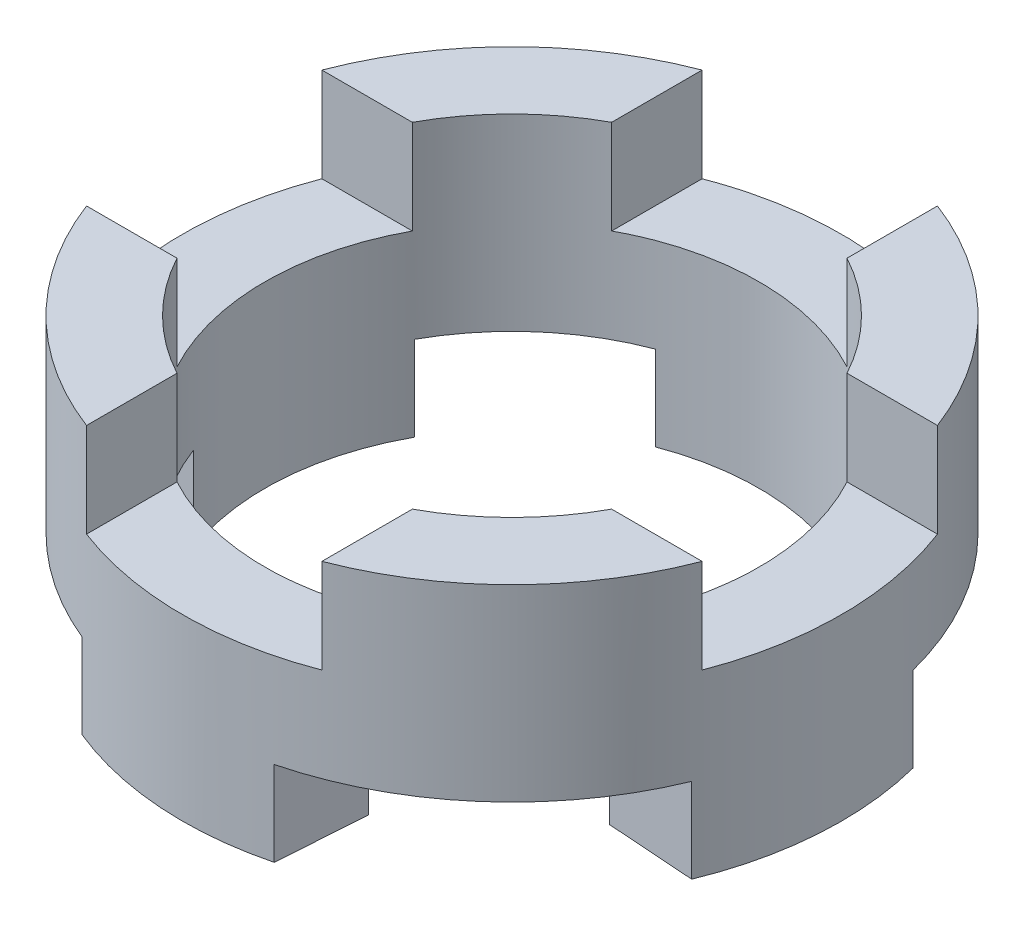
ISO-10303-21;
HEADER;
FILE_DESCRIPTION(('STEP AP214'),'2;1');
FILE_NAME('part.step','',(''),(''),'','','');
FILE_SCHEMA(('AUTOMOTIVE_DESIGN { 1 0 10303 214 1 1 1 1 }'));
ENDSEC;
DATA;
#1=APPLICATION_CONTEXT('core data for automotive mechanical design processes');
#2=APPLICATION_PROTOCOL_DEFINITION('international standard','automotive_design',2000,#1);
#3=PRODUCT_CONTEXT('',#1,'mechanical');
#4=PRODUCT('Part','Part','',(#3));
#5=PRODUCT_RELATED_PRODUCT_CATEGORY('part','',(#4));
#6=PRODUCT_DEFINITION_FORMATION('','',#4);
#7=PRODUCT_DEFINITION_CONTEXT('part definition',#1,'design');
#8=PRODUCT_DEFINITION('design','',#6,#7);
#9=PRODUCT_DEFINITION_SHAPE('','',#8);
#10=(LENGTH_UNIT() NAMED_UNIT(*) SI_UNIT(.MILLI.,.METRE.));
#11=(NAMED_UNIT(*) PLANE_ANGLE_UNIT() SI_UNIT($,.RADIAN.));
#12=(NAMED_UNIT(*) SI_UNIT($,.STERADIAN.) SOLID_ANGLE_UNIT());
#13=UNCERTAINTY_MEASURE_WITH_UNIT(LENGTH_MEASURE(1.E-05),#10,'distance_accuracy_value','');
#14=(GEOMETRIC_REPRESENTATION_CONTEXT(3) GLOBAL_UNCERTAINTY_ASSIGNED_CONTEXT((#13)) GLOBAL_UNIT_ASSIGNED_CONTEXT((#10,
#11,#12)) REPRESENTATION_CONTEXT('',''));
#15=CARTESIAN_POINT('',(0.,0.,0.));
#16=DIRECTION('',(0.,0.,1.));
#17=DIRECTION('',(1.,0.,0.));
#18=AXIS2_PLACEMENT_3D('',#15,#16,#17);
#19=CARTESIAN_POINT('',(0.,0.,0.));
#20=DIRECTION('',(0.,1.,0.));
#21=DIRECTION('',(0.,0.,1.));
#22=AXIS2_PLACEMENT_3D('',#19,#20,#21);
#23=PLANE('',#22);
#24=DIRECTION('',(0.0697564737441258,0.,-0.997564050259824));
#25=VECTOR('',#24,1.);
#26=CARTESIAN_POINT('',(-2.19464091057161,0.,-0.153464242237077));
#27=LINE('',#26,#25);
#28=CARTESIAN_POINT('',(-2.65819354208839,0.,6.47564723350489));
#29=VERTEX_POINT('',#28);
#30=CARTESIAN_POINT('',(-2.52715693125308,0.,4.60173639453843));
#31=VERTEX_POINT('',#30);
#32=EDGE_CURVE('E277',#29,#31,#27,.T.);
#33=ORIENTED_EDGE('',*,*,#32,.F.);
#34=CARTESIAN_POINT('',(0.,0.,0.));
#35=DIRECTION('',(0.,1.,0.));
#36=DIRECTION('',(0.,0.,1.));
#37=AXIS2_PLACEMENT_3D('',#34,#35,#36);
#38=CIRCLE('',#37,7.);
#39=CARTESIAN_POINT('',(-6.78257571797905,0.,1.73108827905483));
#40=VERTEX_POINT('',#39);
#41=EDGE_CURVE('E492',#40,#29,#38,.T.);
#42=ORIENTED_EDGE('',*,*,#41,.F.);
#43=DIRECTION('',(-0.997564050259824,0.,-0.0697564737441261));
#44=VECTOR('',#43,1.);
#45=CARTESIAN_POINT('',(-0.153464242237077,0.,2.19464091057161));
#46=LINE('',#45,#44);
#47=CARTESIAN_POINT('',(-4.90866487901258,0.,1.86212488989015));
#48=VERTEX_POINT('',#47);
#49=EDGE_CURVE('E68',#48,#40,#46,.T.);
#50=ORIENTED_EDGE('',*,*,#49,.F.);
#51=CARTESIAN_POINT('',(0.,0.,0.));
#52=DIRECTION('',(0.,1.,0.));
#53=DIRECTION('',(0.,0.,1.));
#54=AXIS2_PLACEMENT_3D('',#51,#52,#53);
#55=CIRCLE('',#54,5.25);
#56=EDGE_CURVE('E63',#48,#31,#55,.T.);
#57=ORIENTED_EDGE('',*,*,#56,.T.);
#58=EDGE_LOOP('',(#33,#42,#50,#57));
#59=FACE_BOUND('',#58,.T.);
#60=ADVANCED_FACE('F47',(#59),#23,.F.);
#61=DIRECTION('',(-0.0697564737441259,0.,0.997564050259824));
#62=VECTOR('',#61,1.);
#63=CARTESIAN_POINT('',(2.19464091057161,0.,0.153464242237077));
#64=LINE('',#63,#62);
#65=CARTESIAN_POINT('',(1.86212488989015,0.,4.90866487901258));
#66=VERTEX_POINT('',#65);
#67=CARTESIAN_POINT('',(1.73108827905483,0.,6.78257571797905));
#68=VERTEX_POINT('',#67);
#69=EDGE_CURVE('E330',#66,#68,#64,.T.);
#70=ORIENTED_EDGE('',*,*,#69,.F.);
#71=CARTESIAN_POINT('',(4.60173639453843,0.,2.52715693125308));
#72=VERTEX_POINT('',#71);
#73=EDGE_CURVE('E282',#66,#72,#55,.T.);
#74=ORIENTED_EDGE('',*,*,#73,.T.);
#75=DIRECTION('',(-0.997564050259824,0.,-0.0697564737441258));
#76=VECTOR('',#75,1.);
#77=CARTESIAN_POINT('',(-0.153464242237077,0.,2.19464091057161));
#78=LINE('',#77,#76);
#79=CARTESIAN_POINT('',(6.47564723350489,0.,2.65819354208839));
#80=VERTEX_POINT('',#79);
#81=EDGE_CURVE('E383',#80,#72,#78,.T.);
#82=ORIENTED_EDGE('',*,*,#81,.F.);
#83=EDGE_CURVE('E505',#68,#80,#38,.T.);
#84=ORIENTED_EDGE('',*,*,#83,.F.);
#85=EDGE_LOOP('',(#70,#74,#82,#84));
#86=FACE_BOUND('',#85,.T.);
#87=ADVANCED_FACE('F628',(#86),#23,.F.);
#88=DIRECTION('',(0.997564050259824,0.,0.0697564737441262));
#89=VECTOR('',#88,1.);
#90=CARTESIAN_POINT('',(0.153464242237077,0.,-2.19464091057161));
#91=LINE('',#90,#89);
#92=CARTESIAN_POINT('',(-6.47564723350489,0.,-2.65819354208839));
#93=VERTEX_POINT('',#92);
#94=CARTESIAN_POINT('',(-4.60173639453843,0.,-2.52715693125308));
#95=VERTEX_POINT('',#94);
#96=EDGE_CURVE('E308',#93,#95,#91,.T.);
#97=ORIENTED_EDGE('',*,*,#96,.F.);
#98=CARTESIAN_POINT('',(-1.73108827905483,0.,-6.78257571797905));
#99=VERTEX_POINT('',#98);
#100=EDGE_CURVE('E654',#99,#93,#38,.T.);
#101=ORIENTED_EDGE('',*,*,#100,.F.);
#102=DIRECTION('',(0.0697564737441257,0.,-0.997564050259824));
#103=VECTOR('',#102,1.);
#104=CARTESIAN_POINT('',(-2.19464091057161,0.,-0.153464242237077));
#105=LINE('',#104,#103);
#106=CARTESIAN_POINT('',(-1.86212488989015,0.,-4.90866487901258));
#107=VERTEX_POINT('',#106);
#108=EDGE_CURVE('E336',#107,#99,#105,.T.);
#109=ORIENTED_EDGE('',*,*,#108,.F.);
#110=EDGE_CURVE('E667',#107,#95,#55,.T.);
#111=ORIENTED_EDGE('',*,*,#110,.T.);
#112=EDGE_LOOP('',(#97,#101,#109,#111));
#113=FACE_BOUND('',#112,.T.);
#114=ADVANCED_FACE('F634',(#113),#23,.F.);
#115=DIRECTION('',(-0.0697564737441259,0.,0.997564050259824));
#116=VECTOR('',#115,1.);
#117=CARTESIAN_POINT('',(2.19464091057161,0.,0.153464242237077));
#118=LINE('',#117,#116);
#119=CARTESIAN_POINT('',(2.65819354208839,0.,-6.47564723350489));
#120=VERTEX_POINT('',#119);
#121=CARTESIAN_POINT('',(2.52715693125308,0.,-4.60173639453843));
#122=VERTEX_POINT('',#121);
#123=EDGE_CURVE('E346',#120,#122,#118,.T.);
#124=ORIENTED_EDGE('',*,*,#123,.F.);
#125=CARTESIAN_POINT('',(6.78257571797905,0.,-1.73108827905484));
#126=VERTEX_POINT('',#125);
#127=EDGE_CURVE('E509',#126,#120,#38,.T.);
#128=ORIENTED_EDGE('',*,*,#127,.F.);
#129=DIRECTION('',(0.997564050259824,0.,0.0697564737441258));
#130=VECTOR('',#129,1.);
#131=CARTESIAN_POINT('',(0.153464242237077,0.,-2.19464091057161));
#132=LINE('',#131,#130);
#133=CARTESIAN_POINT('',(4.90866487901258,0.,-1.86212488989015));
#134=VERTEX_POINT('',#133);
#135=EDGE_CURVE('E373',#134,#126,#132,.T.);
#136=ORIENTED_EDGE('',*,*,#135,.F.);
#137=EDGE_CURVE('E497',#134,#122,#55,.T.);
#138=ORIENTED_EDGE('',*,*,#137,.T.);
#139=EDGE_LOOP('',(#124,#128,#136,#138));
#140=FACE_BOUND('',#139,.T.);
#141=ADVANCED_FACE('F629',(#140),#23,.F.);
#142=CARTESIAN_POINT('',(0.,4.,0.));
#143=DIRECTION('',(0.,1.,0.));
#144=DIRECTION('',(0.,0.,1.));
#145=AXIS2_PLACEMENT_3D('',#142,#143,#144);
#146=PLANE('',#145);
#147=DIRECTION('',(-1.,0.,0.));
#148=VECTOR('',#147,1.);
#149=CARTESIAN_POINT('',(-8.,4.,-2.5));
#150=LINE('',#149,#148);
#151=CARTESIAN_POINT('',(-4.61654632815485,4.,-2.5));
#152=VERTEX_POINT('',#151);
#153=CARTESIAN_POINT('',(-6.53834841531101,4.,-2.5));
#154=VERTEX_POINT('',#153);
#155=EDGE_CURVE('E284',#152,#154,#150,.T.);
#156=ORIENTED_EDGE('',*,*,#155,.F.);
#157=CARTESIAN_POINT('',(0.,4.,0.));
#158=DIRECTION('',(0.,1.,0.));
#159=DIRECTION('',(0.,0.,1.));
#160=AXIS2_PLACEMENT_3D('',#157,#158,#159);
#161=CIRCLE('',#160,5.25);
#162=CARTESIAN_POINT('',(-2.5,4.,-4.61654632815485));
#163=VERTEX_POINT('',#162);
#164=EDGE_CURVE('E595',#163,#152,#161,.T.);
#165=ORIENTED_EDGE('',*,*,#164,.F.);
#166=DIRECTION('',(0.,0.,1.));
#167=VECTOR('',#166,1.);
#168=CARTESIAN_POINT('',(-2.5,4.,-2.5));
#169=LINE('',#168,#167);
#170=CARTESIAN_POINT('',(-2.5,4.,-6.53834841531101));
#171=VERTEX_POINT('',#170);
#172=EDGE_CURVE('E408',#171,#163,#169,.T.);
#173=ORIENTED_EDGE('',*,*,#172,.F.);
#174=CARTESIAN_POINT('',(0.,4.,0.));
#175=DIRECTION('',(0.,1.,0.));
#176=DIRECTION('',(0.,0.,1.));
#177=AXIS2_PLACEMENT_3D('',#174,#175,#176);
#178=CIRCLE('',#177,7.);
#179=EDGE_CURVE('E569',#171,#154,#178,.T.);
#180=ORIENTED_EDGE('',*,*,#179,.T.);
#181=EDGE_LOOP('',(#156,#165,#173,#180));
#182=FACE_BOUND('',#181,.T.);
#183=ADVANCED_FACE('F572',(#182),#146,.T.);
#184=DIRECTION('',(0.,0.,-1.));
#185=VECTOR('',#184,1.);
#186=CARTESIAN_POINT('',(2.5,4.,-8.));
#187=LINE('',#186,#185);
#188=CARTESIAN_POINT('',(2.5,4.,-4.61654632815485));
#189=VERTEX_POINT('',#188);
#190=CARTESIAN_POINT('',(2.5,4.,-6.53834841531101));
#191=VERTEX_POINT('',#190);
#192=EDGE_CURVE('E447',#189,#191,#187,.T.);
#193=ORIENTED_EDGE('',*,*,#192,.F.);
#194=CARTESIAN_POINT('',(4.61654632815485,4.,-2.5));
#195=VERTEX_POINT('',#194);
#196=EDGE_CURVE('E493',#195,#189,#161,.T.);
#197=ORIENTED_EDGE('',*,*,#196,.F.);
#198=DIRECTION('',(-1.,0.,0.));
#199=VECTOR('',#198,1.);
#200=CARTESIAN_POINT('',(2.5,4.,-2.5));
#201=LINE('',#200,#199);
#202=CARTESIAN_POINT('',(6.53834841531101,4.,-2.5));
#203=VERTEX_POINT('',#202);
#204=EDGE_CURVE('E444',#203,#195,#201,.T.);
#205=ORIENTED_EDGE('',*,*,#204,.F.);
#206=EDGE_CURVE('E503',#203,#191,#178,.T.);
#207=ORIENTED_EDGE('',*,*,#206,.T.);
#208=EDGE_LOOP('',(#193,#197,#205,#207));
#209=FACE_BOUND('',#208,.T.);
#210=ADVANCED_FACE('F603',(#209),#146,.T.);
#211=DIRECTION('',(1.,0.,0.));
#212=VECTOR('',#211,1.);
#213=CARTESIAN_POINT('',(8.,4.,2.5));
#214=LINE('',#213,#212);
#215=CARTESIAN_POINT('',(4.61654632815485,4.,2.5));
#216=VERTEX_POINT('',#215);
#217=CARTESIAN_POINT('',(6.53834841531101,4.,2.5));
#218=VERTEX_POINT('',#217);
#219=EDGE_CURVE('E441',#216,#218,#214,.T.);
#220=ORIENTED_EDGE('',*,*,#219,.F.);
#221=CARTESIAN_POINT('',(2.5,4.,4.61654632815485));
#222=VERTEX_POINT('',#221);
#223=EDGE_CURVE('E488',#222,#216,#161,.T.);
#224=ORIENTED_EDGE('',*,*,#223,.F.);
#225=DIRECTION('',(0.,0.,-1.));
#226=VECTOR('',#225,1.);
#227=CARTESIAN_POINT('',(2.5,4.,2.5));
#228=LINE('',#227,#226);
#229=CARTESIAN_POINT('',(2.5,4.,6.53834841531101));
#230=VERTEX_POINT('',#229);
#231=EDGE_CURVE('E438',#230,#222,#228,.T.);
#232=ORIENTED_EDGE('',*,*,#231,.F.);
#233=EDGE_CURVE('E498',#230,#218,#178,.T.);
#234=ORIENTED_EDGE('',*,*,#233,.T.);
#235=EDGE_LOOP('',(#220,#224,#232,#234));
#236=FACE_BOUND('',#235,.T.);
#237=ADVANCED_FACE('F761',(#236),#146,.T.);
#238=DIRECTION('',(0.,0.,1.));
#239=VECTOR('',#238,1.);
#240=CARTESIAN_POINT('',(-2.5,4.,8.));
#241=LINE('',#240,#239);
#242=CARTESIAN_POINT('',(-2.5,4.,4.61654632815485));
#243=VERTEX_POINT('',#242);
#244=CARTESIAN_POINT('',(-2.5,4.,6.53834841531101));
#245=VERTEX_POINT('',#244);
#246=EDGE_CURVE('E435',#243,#245,#241,.T.);
#247=ORIENTED_EDGE('',*,*,#246,.F.);
#248=CARTESIAN_POINT('',(-4.61654632815485,4.,2.5));
#249=VERTEX_POINT('',#248);
#250=EDGE_CURVE('E494',#249,#243,#161,.T.);
#251=ORIENTED_EDGE('',*,*,#250,.F.);
#252=DIRECTION('',(1.,0.,0.));
#253=VECTOR('',#252,1.);
#254=CARTESIAN_POINT('',(-2.5,4.,2.5));
#255=LINE('',#254,#253);
#256=CARTESIAN_POINT('',(-6.53834841531101,4.,2.5));
#257=VERTEX_POINT('',#256);
#258=EDGE_CURVE('E288',#257,#249,#255,.T.);
#259=ORIENTED_EDGE('',*,*,#258,.F.);
#260=EDGE_CURVE('E504',#257,#245,#178,.T.);
#261=ORIENTED_EDGE('',*,*,#260,.T.);
#262=EDGE_LOOP('',(#247,#251,#259,#261));
#263=FACE_BOUND('',#262,.T.);
#264=ADVANCED_FACE('F583',(#263),#146,.T.);
#265=CARTESIAN_POINT('',(0.,4.,0.));
#266=DIRECTION('',(0.,-1.,0.));
#267=DIRECTION('',(0.,0.,-1.));
#268=AXIS2_PLACEMENT_3D('',#265,#266,#267);
#269=CYLINDRICAL_SURFACE('',#268,7.);
#270=ORIENTED_EDGE('',*,*,#206,.F.);
#271=DIRECTION('',(0.,-1.,0.));
#272=VECTOR('',#271,1.);
#273=CARTESIAN_POINT('',(6.53834841531101,4.,-2.5));
#274=LINE('',#273,#272);
#275=CARTESIAN_POINT('',(6.53834841531101,2.,-2.5));
#276=VERTEX_POINT('',#275);
#277=EDGE_CURVE('E472',#203,#276,#274,.T.);
#278=ORIENTED_EDGE('',*,*,#277,.T.);
#279=CARTESIAN_POINT('',(0.,2.,0.));
#280=DIRECTION('',(0.,1.,0.));
#281=DIRECTION('',(0.,0.,1.));
#282=AXIS2_PLACEMENT_3D('',#279,#280,#281);
#283=CIRCLE('',#282,7.);
#284=CARTESIAN_POINT('',(6.53834841531101,2.,2.5));
#285=VERTEX_POINT('',#284);
#286=EDGE_CURVE('E455',#285,#276,#283,.T.);
#287=ORIENTED_EDGE('',*,*,#286,.F.);
#288=DIRECTION('',(0.,-1.,0.));
#289=VECTOR('',#288,1.);
#290=CARTESIAN_POINT('',(6.53834841531101,4.,2.5));
#291=LINE('',#290,#289);
#292=EDGE_CURVE('E468',#285,#218,#291,.F.);
#293=ORIENTED_EDGE('',*,*,#292,.T.);
#294=ORIENTED_EDGE('',*,*,#233,.F.);
#295=DIRECTION('',(0.,-1.,0.));
#296=VECTOR('',#295,1.);
#297=CARTESIAN_POINT('',(2.5,4.,6.53834841531101));
#298=LINE('',#297,#296);
#299=CARTESIAN_POINT('',(2.5,2.,6.53834841531101));
#300=VERTEX_POINT('',#299);
#301=EDGE_CURVE('E464',#230,#300,#298,.T.);
#302=ORIENTED_EDGE('',*,*,#301,.T.);
#303=CARTESIAN_POINT('',(-2.5,2.,6.53834841531101));
#304=VERTEX_POINT('',#303);
#305=EDGE_CURVE('E431',#304,#300,#283,.T.);
#306=ORIENTED_EDGE('',*,*,#305,.F.);
#307=DIRECTION('',(0.,-1.,0.));
#308=VECTOR('',#307,1.);
#309=CARTESIAN_POINT('',(-2.5,4.,6.53834841531101));
#310=LINE('',#309,#308);
#311=EDGE_CURVE('E460',#304,#245,#310,.F.);
#312=ORIENTED_EDGE('',*,*,#311,.T.);
#313=ORIENTED_EDGE('',*,*,#260,.F.);
#314=DIRECTION('',(0.,-1.,0.));
#315=VECTOR('',#314,1.);
#316=CARTESIAN_POINT('',(-6.53834841531101,4.,2.5));
#317=LINE('',#316,#315);
#318=CARTESIAN_POINT('',(-6.53834841531101,2.,2.5));
#319=VERTEX_POINT('',#318);
#320=EDGE_CURVE('E456',#257,#319,#317,.T.);
#321=ORIENTED_EDGE('',*,*,#320,.T.);
#322=CARTESIAN_POINT('',(-6.53834841531101,2.,-2.5));
#323=VERTEX_POINT('',#322);
#324=EDGE_CURVE('E454',#323,#319,#283,.T.);
#325=ORIENTED_EDGE('',*,*,#324,.F.);
#326=DIRECTION('',(0.,-1.,0.));
#327=VECTOR('',#326,1.);
#328=CARTESIAN_POINT('',(-6.53834841531101,4.,-2.5));
#329=LINE('',#328,#327);
#330=EDGE_CURVE('E484',#323,#154,#329,.F.);
#331=ORIENTED_EDGE('',*,*,#330,.T.);
#332=ORIENTED_EDGE('',*,*,#179,.F.);
#333=DIRECTION('',(0.,-1.,0.));
#334=VECTOR('',#333,1.);
#335=CARTESIAN_POINT('',(-2.5,4.,-6.53834841531101));
#336=LINE('',#335,#334);
#337=CARTESIAN_POINT('',(-2.5,2.,-6.53834841531101));
#338=VERTEX_POINT('',#337);
#339=EDGE_CURVE('E480',#171,#338,#336,.T.);
#340=ORIENTED_EDGE('',*,*,#339,.T.);
#341=CARTESIAN_POINT('',(2.5,2.,-6.53834841531101));
#342=VERTEX_POINT('',#341);
#343=EDGE_CURVE('E608',#342,#338,#283,.T.);
#344=ORIENTED_EDGE('',*,*,#343,.F.);
#345=DIRECTION('',(0.,-1.,0.));
#346=VECTOR('',#345,1.);
#347=CARTESIAN_POINT('',(2.5,4.,-6.53834841531101));
#348=LINE('',#347,#346);
#349=EDGE_CURVE('E476',#342,#191,#348,.F.);
#350=ORIENTED_EDGE('',*,*,#349,.T.);
#351=EDGE_LOOP('',(#270,#278,#287,#293,#294,#302,#306,#312,#313,#321,#325,#331,#332,#340,#344,#350));
#352=FACE_BOUND('',#351,.T.);
#353=ORIENTED_EDGE('',*,*,#83,.T.);
#354=DIRECTION('',(0.,1.,0.));
#355=VECTOR('',#354,1.);
#356=CARTESIAN_POINT('',(6.47564723350489,-1.8,2.65819354208839));
#357=LINE('',#356,#355);
#358=CARTESIAN_POINT('',(6.47564723350489,-1.8,2.65819354208839));
#359=VERTEX_POINT('',#358);
#360=EDGE_CURVE('E350',#359,#80,#357,.T.);
#361=ORIENTED_EDGE('',*,*,#360,.F.);
#362=CARTESIAN_POINT('',(0.,-1.8,0.));
#363=DIRECTION('',(0.,-1.,0.));
#364=DIRECTION('',(0.,0.,-1.));
#365=AXIS2_PLACEMENT_3D('',#362,#363,#364);
#366=CIRCLE('',#365,7.);
#367=CARTESIAN_POINT('',(6.78257571797905,-1.8,-1.73108827905484));
#368=VERTEX_POINT('',#367);
#369=EDGE_CURVE('E368',#368,#359,#366,.T.);
#370=ORIENTED_EDGE('',*,*,#369,.F.);
#371=DIRECTION('',(0.,1.,0.));
#372=VECTOR('',#371,1.);
#373=CARTESIAN_POINT('',(6.78257571797905,-1.8,-1.73108827905484));
#374=LINE('',#373,#372);
#375=EDGE_CURVE('E382',#368,#126,#374,.T.);
#376=ORIENTED_EDGE('',*,*,#375,.T.);
#377=ORIENTED_EDGE('',*,*,#127,.T.);
#378=DIRECTION('',(0.,1.,0.));
#379=VECTOR('',#378,1.);
#380=CARTESIAN_POINT('',(2.65819354208839,-1.8,-6.47564723350489));
#381=LINE('',#380,#379);
#382=CARTESIAN_POINT('',(2.65819354208839,-1.8,-6.47564723350489));
#383=VERTEX_POINT('',#382);
#384=EDGE_CURVE('E312',#383,#120,#381,.T.);
#385=ORIENTED_EDGE('',*,*,#384,.F.);
#386=CARTESIAN_POINT('',(0.,-1.8,0.));
#387=DIRECTION('',(0.,-1.,0.));
#388=DIRECTION('',(0.,0.,-1.));
#389=AXIS2_PLACEMENT_3D('',#386,#387,#388);
#390=CIRCLE('',#389,7.);
#391=CARTESIAN_POINT('',(-1.73108827905483,-1.8,-6.78257571797905));
#392=VERTEX_POINT('',#391);
#393=EDGE_CURVE('E331',#392,#383,#390,.T.);
#394=ORIENTED_EDGE('',*,*,#393,.F.);
#395=DIRECTION('',(0.,1.,0.));
#396=VECTOR('',#395,1.);
#397=CARTESIAN_POINT('',(-1.73108827905483,-1.8,-6.78257571797905));
#398=LINE('',#397,#396);
#399=EDGE_CURVE('E345',#392,#99,#398,.T.);
#400=ORIENTED_EDGE('',*,*,#399,.T.);
#401=ORIENTED_EDGE('',*,*,#100,.T.);
#402=DIRECTION('',(0.,1.,0.));
#403=VECTOR('',#402,1.);
#404=CARTESIAN_POINT('',(-6.47564723350489,-1.8,-2.65819354208839));
#405=LINE('',#404,#403);
#406=CARTESIAN_POINT('',(-6.47564723350489,-1.8,-2.65819354208839));
#407=VERTEX_POINT('',#406);
#408=EDGE_CURVE('E326',#407,#93,#405,.T.);
#409=ORIENTED_EDGE('',*,*,#408,.F.);
#410=CARTESIAN_POINT('',(0.,-1.8,0.));
#411=DIRECTION('',(0.,-1.,0.));
#412=DIRECTION('',(0.,0.,-1.));
#413=AXIS2_PLACEMENT_3D('',#410,#411,#412);
#414=CIRCLE('',#413,7.);
#415=CARTESIAN_POINT('',(-6.78257571797905,-1.8,1.73108827905483));
#416=VERTEX_POINT('',#415);
#417=EDGE_CURVE('E294',#416,#407,#414,.T.);
#418=ORIENTED_EDGE('',*,*,#417,.F.);
#419=DIRECTION('',(0.,1.,0.));
#420=VECTOR('',#419,1.);
#421=CARTESIAN_POINT('',(-6.78257571797905,-1.8,1.73108827905483));
#422=LINE('',#421,#420);
#423=EDGE_CURVE('E307',#416,#40,#422,.T.);
#424=ORIENTED_EDGE('',*,*,#423,.T.);
#425=ORIENTED_EDGE('',*,*,#41,.T.);
#426=DIRECTION('',(0.,1.,0.));
#427=VECTOR('',#426,1.);
#428=CARTESIAN_POINT('',(-2.65819354208839,-1.8,6.47564723350489));
#429=LINE('',#428,#427);
#430=CARTESIAN_POINT('',(-2.65819354208839,-1.8,6.47564723350489));
#431=VERTEX_POINT('',#430);
#432=EDGE_CURVE('E290',#431,#29,#429,.T.);
#433=ORIENTED_EDGE('',*,*,#432,.F.);
#434=CARTESIAN_POINT('',(0.,-1.8,0.));
#435=DIRECTION('',(0.,-1.,0.));
#436=DIRECTION('',(0.,0.,-1.));
#437=AXIS2_PLACEMENT_3D('',#434,#435,#436);
#438=CIRCLE('',#437,7.);
#439=CARTESIAN_POINT('',(1.73108827905483,-1.8,6.78257571797905));
#440=VERTEX_POINT('',#439);
#441=EDGE_CURVE('E266',#440,#431,#438,.T.);
#442=ORIENTED_EDGE('',*,*,#441,.F.);
#443=DIRECTION('',(0.,1.,0.));
#444=VECTOR('',#443,1.);
#445=CARTESIAN_POINT('',(1.73108827905483,-1.8,6.78257571797905));
#446=LINE('',#445,#444);
#447=EDGE_CURVE('E262',#440,#68,#446,.T.);
#448=ORIENTED_EDGE('',*,*,#447,.T.);
#449=EDGE_LOOP('',(#353,#361,#370,#376,#377,#385,#394,#400,#401,#409,#418,#424,#425,#433,#442,#448));
#450=FACE_BOUND('',#449,.T.);
#451=ADVANCED_FACE('F49',(#352,#450),#269,.T.);
#452=CARTESIAN_POINT('',(0.,4.,0.));
#453=DIRECTION('',(0.,-1.,0.));
#454=DIRECTION('',(0.,0.,-1.));
#455=AXIS2_PLACEMENT_3D('',#452,#453,#454);
#456=CYLINDRICAL_SURFACE('',#455,5.25);
#457=DIRECTION('',(0.,-1.,0.));
#458=VECTOR('',#457,1.);
#459=CARTESIAN_POINT('',(4.61654632815485,4.,-2.5));
#460=LINE('',#459,#458);
#461=CARTESIAN_POINT('',(4.61654632815485,2.,-2.5));
#462=VERTEX_POINT('',#461);
#463=EDGE_CURVE('E11',#195,#462,#460,.T.);
#464=ORIENTED_EDGE('',*,*,#463,.F.);
#465=ORIENTED_EDGE('',*,*,#196,.T.);
#466=DIRECTION('',(0.,-1.,0.));
#467=VECTOR('',#466,1.);
#468=CARTESIAN_POINT('',(2.5,4.,-4.61654632815485));
#469=LINE('',#468,#467);
#470=CARTESIAN_POINT('',(2.5,2.,-4.61654632815485));
#471=VERTEX_POINT('',#470);
#472=EDGE_CURVE('E530',#471,#189,#469,.F.);
#473=ORIENTED_EDGE('',*,*,#472,.F.);
#474=CARTESIAN_POINT('',(0.,2.,0.));
#475=DIRECTION('',(0.,1.,0.));
#476=DIRECTION('',(0.,0.,1.));
#477=AXIS2_PLACEMENT_3D('',#474,#475,#476);
#478=CIRCLE('',#477,5.25);
#479=CARTESIAN_POINT('',(-2.5,2.,-4.61654632815485));
#480=VERTEX_POINT('',#479);
#481=EDGE_CURVE('E529',#471,#480,#478,.T.);
#482=ORIENTED_EDGE('',*,*,#481,.T.);
#483=DIRECTION('',(0.,-1.,0.));
#484=VECTOR('',#483,1.);
#485=CARTESIAN_POINT('',(-2.5,4.,-4.61654632815485));
#486=LINE('',#485,#484);
#487=EDGE_CURVE('E533',#163,#480,#486,.T.);
#488=ORIENTED_EDGE('',*,*,#487,.F.);
#489=ORIENTED_EDGE('',*,*,#164,.T.);
#490=DIRECTION('',(0.,-1.,0.));
#491=VECTOR('',#490,1.);
#492=CARTESIAN_POINT('',(-4.61654632815485,4.,-2.5));
#493=LINE('',#492,#491);
#494=CARTESIAN_POINT('',(-4.61654632815485,2.,-2.5));
#495=VERTEX_POINT('',#494);
#496=EDGE_CURVE('E526',#495,#152,#493,.F.);
#497=ORIENTED_EDGE('',*,*,#496,.F.);
#498=CARTESIAN_POINT('',(-4.61654632815485,2.,2.5));
#499=VERTEX_POINT('',#498);
#500=EDGE_CURVE('E515',#495,#499,#478,.T.);
#501=ORIENTED_EDGE('',*,*,#500,.T.);
#502=DIRECTION('',(0.,-1.,0.));
#503=VECTOR('',#502,1.);
#504=CARTESIAN_POINT('',(-4.61654632815485,4.,2.5));
#505=LINE('',#504,#503);
#506=EDGE_CURVE('E522',#249,#499,#505,.T.);
#507=ORIENTED_EDGE('',*,*,#506,.F.);
#508=ORIENTED_EDGE('',*,*,#250,.T.);
#509=DIRECTION('',(0.,-1.,0.));
#510=VECTOR('',#509,1.);
#511=CARTESIAN_POINT('',(-2.5,4.,4.61654632815485));
#512=LINE('',#511,#510);
#513=CARTESIAN_POINT('',(-2.5,2.,4.61654632815485));
#514=VERTEX_POINT('',#513);
#515=EDGE_CURVE('E513',#514,#243,#512,.F.);
#516=ORIENTED_EDGE('',*,*,#515,.F.);
#517=CARTESIAN_POINT('',(2.5,2.,4.61654632815485));
#518=VERTEX_POINT('',#517);
#519=EDGE_CURVE('E502',#514,#518,#478,.T.);
#520=ORIENTED_EDGE('',*,*,#519,.T.);
#521=DIRECTION('',(0.,-1.,0.));
#522=VECTOR('',#521,1.);
#523=CARTESIAN_POINT('',(2.5,4.,4.61654632815485));
#524=LINE('',#523,#522);
#525=EDGE_CURVE('E518',#222,#518,#524,.T.);
#526=ORIENTED_EDGE('',*,*,#525,.F.);
#527=ORIENTED_EDGE('',*,*,#223,.T.);
#528=DIRECTION('',(0.,-1.,0.));
#529=VECTOR('',#528,1.);
#530=CARTESIAN_POINT('',(4.61654632815485,4.,2.5));
#531=LINE('',#530,#529);
#532=CARTESIAN_POINT('',(4.61654632815485,2.,2.5));
#533=VERTEX_POINT('',#532);
#534=EDGE_CURVE('E56',#533,#216,#531,.F.);
#535=ORIENTED_EDGE('',*,*,#534,.F.);
#536=EDGE_CURVE('E514',#533,#462,#478,.T.);
#537=ORIENTED_EDGE('',*,*,#536,.T.);
#538=EDGE_LOOP('',(#464,#465,#473,#482,#488,#489,#497,#501,#507,#508,#516,#520,#526,#527,#535,#537));
#539=FACE_BOUND('',#538,.T.);
#540=ORIENTED_EDGE('',*,*,#73,.F.);
#541=DIRECTION('',(0.,1.,0.));
#542=VECTOR('',#541,1.);
#543=CARTESIAN_POINT('',(1.86212488989015,-1.8,4.90866487901258));
#544=LINE('',#543,#542);
#545=CARTESIAN_POINT('',(1.86212488989015,-1.8,4.90866487901258));
#546=VERTEX_POINT('',#545);
#547=EDGE_CURVE('E260',#546,#66,#544,.T.);
#548=ORIENTED_EDGE('',*,*,#547,.F.);
#549=CARTESIAN_POINT('',(0.,-1.8,0.));
#550=DIRECTION('',(0.,-1.,0.));
#551=DIRECTION('',(0.,0.,-1.));
#552=AXIS2_PLACEMENT_3D('',#549,#550,#551);
#553=CIRCLE('',#552,5.25);
#554=CARTESIAN_POINT('',(-2.52715693125308,-1.8,4.60173639453843));
#555=VERTEX_POINT('',#554);
#556=EDGE_CURVE('E267',#555,#546,#553,.F.);
#557=ORIENTED_EDGE('',*,*,#556,.F.);
#558=DIRECTION('',(0.,1.,0.));
#559=VECTOR('',#558,1.);
#560=CARTESIAN_POINT('',(-2.52715693125308,-1.8,4.60173639453843));
#561=LINE('',#560,#559);
#562=EDGE_CURVE('E684',#555,#31,#561,.T.);
#563=ORIENTED_EDGE('',*,*,#562,.T.);
#564=ORIENTED_EDGE('',*,*,#56,.F.);
#565=DIRECTION('',(0.,1.,0.));
#566=VECTOR('',#565,1.);
#567=CARTESIAN_POINT('',(-4.90866487901258,-1.8,1.86212488989015));
#568=LINE('',#567,#566);
#569=CARTESIAN_POINT('',(-4.90866487901258,-1.8,1.86212488989015));
#570=VERTEX_POINT('',#569);
#571=EDGE_CURVE('E318',#570,#48,#568,.T.);
#572=ORIENTED_EDGE('',*,*,#571,.F.);
#573=CARTESIAN_POINT('',(0.,-1.8,0.));
#574=DIRECTION('',(0.,-1.,0.));
#575=DIRECTION('',(0.,0.,-1.));
#576=AXIS2_PLACEMENT_3D('',#573,#574,#575);
#577=CIRCLE('',#576,5.25);
#578=CARTESIAN_POINT('',(-4.60173639453843,-1.8,-2.52715693125308));
#579=VERTEX_POINT('',#578);
#580=EDGE_CURVE('E301',#579,#570,#577,.F.);
#581=ORIENTED_EDGE('',*,*,#580,.F.);
#582=DIRECTION('',(0.,1.,0.));
#583=VECTOR('',#582,1.);
#584=CARTESIAN_POINT('',(-4.60173639453843,-1.8,-2.52715693125308));
#585=LINE('',#584,#583);
#586=EDGE_CURVE('E322',#579,#95,#585,.T.);
#587=ORIENTED_EDGE('',*,*,#586,.T.);
#588=ORIENTED_EDGE('',*,*,#110,.F.);
#589=DIRECTION('',(0.,1.,0.));
#590=VECTOR('',#589,1.);
#591=CARTESIAN_POINT('',(-1.86212488989015,-1.8,-4.90866487901258));
#592=LINE('',#591,#590);
#593=CARTESIAN_POINT('',(-1.86212488989015,-1.8,-4.90866487901258));
#594=VERTEX_POINT('',#593);
#595=EDGE_CURVE('E357',#594,#107,#592,.T.);
#596=ORIENTED_EDGE('',*,*,#595,.F.);
#597=CARTESIAN_POINT('',(0.,-1.8,0.));
#598=DIRECTION('',(0.,-1.,0.));
#599=DIRECTION('',(0.,0.,-1.));
#600=AXIS2_PLACEMENT_3D('',#597,#598,#599);
#601=CIRCLE('',#600,5.25);
#602=CARTESIAN_POINT('',(2.52715693125308,-1.8,-4.60173639453843));
#603=VERTEX_POINT('',#602);
#604=EDGE_CURVE('E339',#603,#594,#601,.F.);
#605=ORIENTED_EDGE('',*,*,#604,.F.);
#606=DIRECTION('',(0.,1.,0.));
#607=VECTOR('',#606,1.);
#608=CARTESIAN_POINT('',(2.52715693125308,-1.8,-4.60173639453843));
#609=LINE('',#608,#607);
#610=EDGE_CURVE('E361',#603,#122,#609,.T.);
#611=ORIENTED_EDGE('',*,*,#610,.T.);
#612=ORIENTED_EDGE('',*,*,#137,.F.);
#613=DIRECTION('',(0.,1.,0.));
#614=VECTOR('',#613,1.);
#615=CARTESIAN_POINT('',(4.90866487901258,-1.8,-1.86212488989015));
#616=LINE('',#615,#614);
#617=CARTESIAN_POINT('',(4.90866487901258,-1.8,-1.86212488989015));
#618=VERTEX_POINT('',#617);
#619=EDGE_CURVE('E393',#618,#134,#616,.T.);
#620=ORIENTED_EDGE('',*,*,#619,.F.);
#621=CARTESIAN_POINT('',(0.,-1.8,0.));
#622=DIRECTION('',(0.,-1.,0.));
#623=DIRECTION('',(0.,0.,-1.));
#624=AXIS2_PLACEMENT_3D('',#621,#622,#623);
#625=CIRCLE('',#624,5.25);
#626=CARTESIAN_POINT('',(4.60173639453843,-1.8,2.52715693125308));
#627=VERTEX_POINT('',#626);
#628=EDGE_CURVE('E376',#627,#618,#625,.F.);
#629=ORIENTED_EDGE('',*,*,#628,.F.);
#630=DIRECTION('',(0.,1.,0.));
#631=VECTOR('',#630,1.);
#632=CARTESIAN_POINT('',(4.60173639453843,-1.8,2.52715693125308));
#633=LINE('',#632,#631);
#634=EDGE_CURVE('E397',#627,#72,#633,.T.);
#635=ORIENTED_EDGE('',*,*,#634,.T.);
#636=EDGE_LOOP('',(#540,#548,#557,#563,#564,#572,#581,#587,#588,#596,#605,#611,#612,#620,#629,#635));
#637=FACE_BOUND('',#636,.T.);
#638=ADVANCED_FACE('F280',(#539,#637),#456,.F.);
#639=CARTESIAN_POINT('',(0.,2.,0.));
#640=DIRECTION('',(0.,1.,0.));
#641=DIRECTION('',(0.,0.,1.));
#642=AXIS2_PLACEMENT_3D('',#639,#640,#641);
#643=PLANE('',#642);
#644=ORIENTED_EDGE('',*,*,#305,.T.);
#645=DIRECTION('',(0.,0.,-1.));
#646=VECTOR('',#645,1.);
#647=CARTESIAN_POINT('',(2.5,2.,2.5));
#648=LINE('',#647,#646);
#649=EDGE_CURVE('E415',#300,#518,#648,.T.);
#650=ORIENTED_EDGE('',*,*,#649,.T.);
#651=ORIENTED_EDGE('',*,*,#519,.F.);
#652=DIRECTION('',(0.,0.,1.));
#653=VECTOR('',#652,1.);
#654=CARTESIAN_POINT('',(-2.5,2.,8.));
#655=LINE('',#654,#653);
#656=EDGE_CURVE('E411',#514,#304,#655,.T.);
#657=ORIENTED_EDGE('',*,*,#656,.T.);
#658=EDGE_LOOP('',(#644,#650,#651,#657));
#659=FACE_BOUND('',#658,.T.);
#660=ADVANCED_FACE('F590',(#659),#643,.T.);
#661=CARTESIAN_POINT('',(-2.5,2.,8.));
#662=DIRECTION('',(-1.,0.,0.));
#663=DIRECTION('',(0.,0.,1.));
#664=AXIS2_PLACEMENT_3D('',#661,#662,#663);
#665=PLANE('',#664);
#666=ORIENTED_EDGE('',*,*,#656,.F.);
#667=ORIENTED_EDGE('',*,*,#515,.T.);
#668=ORIENTED_EDGE('',*,*,#246,.T.);
#669=ORIENTED_EDGE('',*,*,#311,.F.);
#670=EDGE_LOOP('',(#666,#667,#668,#669));
#671=FACE_BOUND('',#670,.T.);
#672=ADVANCED_FACE('F587',(#671),#665,.F.);
#673=CARTESIAN_POINT('',(2.5,2.,2.5));
#674=DIRECTION('',(1.,0.,0.));
#675=DIRECTION('',(0.,0.,-1.));
#676=AXIS2_PLACEMENT_3D('',#673,#674,#675);
#677=PLANE('',#676);
#678=ORIENTED_EDGE('',*,*,#231,.T.);
#679=ORIENTED_EDGE('',*,*,#525,.T.);
#680=ORIENTED_EDGE('',*,*,#649,.F.);
#681=ORIENTED_EDGE('',*,*,#301,.F.);
#682=EDGE_LOOP('',(#678,#679,#680,#681));
#683=FACE_BOUND('',#682,.T.);
#684=ADVANCED_FACE('F624',(#683),#677,.F.);
#685=ORIENTED_EDGE('',*,*,#324,.T.);
#686=DIRECTION('',(1.,0.,0.));
#687=VECTOR('',#686,1.);
#688=CARTESIAN_POINT('',(-2.5,2.,2.5));
#689=LINE('',#688,#687);
#690=EDGE_CURVE('E407',#319,#499,#689,.T.);
#691=ORIENTED_EDGE('',*,*,#690,.T.);
#692=ORIENTED_EDGE('',*,*,#500,.F.);
#693=DIRECTION('',(-1.,0.,0.));
#694=VECTOR('',#693,1.);
#695=CARTESIAN_POINT('',(-8.,2.,-2.5));
#696=LINE('',#695,#694);
#697=EDGE_CURVE('E403',#495,#323,#696,.T.);
#698=ORIENTED_EDGE('',*,*,#697,.T.);
#699=EDGE_LOOP('',(#685,#691,#692,#698));
#700=FACE_BOUND('',#699,.T.);
#701=ADVANCED_FACE('F558',(#700),#643,.T.);
#702=CARTESIAN_POINT('',(-2.5,2.,2.5));
#703=DIRECTION('',(0.,0.,1.));
#704=DIRECTION('',(1.,0.,0.));
#705=AXIS2_PLACEMENT_3D('',#702,#703,#704);
#706=PLANE('',#705);
#707=ORIENTED_EDGE('',*,*,#258,.T.);
#708=ORIENTED_EDGE('',*,*,#506,.T.);
#709=ORIENTED_EDGE('',*,*,#690,.F.);
#710=ORIENTED_EDGE('',*,*,#320,.F.);
#711=EDGE_LOOP('',(#707,#708,#709,#710));
#712=FACE_BOUND('',#711,.T.);
#713=ADVANCED_FACE('F615',(#712),#706,.F.);
#714=CARTESIAN_POINT('',(-8.,2.,-2.5));
#715=DIRECTION('',(0.,0.,-1.));
#716=DIRECTION('',(-1.,0.,0.));
#717=AXIS2_PLACEMENT_3D('',#714,#715,#716);
#718=PLANE('',#717);
#719=ORIENTED_EDGE('',*,*,#697,.F.);
#720=ORIENTED_EDGE('',*,*,#496,.T.);
#721=ORIENTED_EDGE('',*,*,#155,.T.);
#722=ORIENTED_EDGE('',*,*,#330,.F.);
#723=EDGE_LOOP('',(#719,#720,#721,#722));
#724=FACE_BOUND('',#723,.T.);
#725=ADVANCED_FACE('F562',(#724),#718,.F.);
#726=ORIENTED_EDGE('',*,*,#343,.T.);
#727=DIRECTION('',(0.,0.,1.));
#728=VECTOR('',#727,1.);
#729=CARTESIAN_POINT('',(-2.5,2.,-2.5));
#730=LINE('',#729,#728);
#731=EDGE_CURVE('E429',#338,#480,#730,.T.);
#732=ORIENTED_EDGE('',*,*,#731,.T.);
#733=ORIENTED_EDGE('',*,*,#481,.F.);
#734=DIRECTION('',(0.,0.,-1.));
#735=VECTOR('',#734,1.);
#736=CARTESIAN_POINT('',(2.5,2.,-8.));
#737=LINE('',#736,#735);
#738=EDGE_CURVE('E425',#471,#342,#737,.T.);
#739=ORIENTED_EDGE('',*,*,#738,.T.);
#740=EDGE_LOOP('',(#726,#732,#733,#739));
#741=FACE_BOUND('',#740,.T.);
#742=ADVANCED_FACE('F622',(#741),#643,.T.);
#743=CARTESIAN_POINT('',(2.5,2.,-8.));
#744=DIRECTION('',(1.,0.,0.));
#745=DIRECTION('',(0.,0.,-1.));
#746=AXIS2_PLACEMENT_3D('',#743,#744,#745);
#747=PLANE('',#746);
#748=ORIENTED_EDGE('',*,*,#738,.F.);
#749=ORIENTED_EDGE('',*,*,#472,.T.);
#750=ORIENTED_EDGE('',*,*,#192,.T.);
#751=ORIENTED_EDGE('',*,*,#349,.F.);
#752=EDGE_LOOP('',(#748,#749,#750,#751));
#753=FACE_BOUND('',#752,.T.);
#754=ADVANCED_FACE('F606',(#753),#747,.F.);
#755=CARTESIAN_POINT('',(-2.5,2.,-2.5));
#756=DIRECTION('',(-1.,0.,0.));
#757=DIRECTION('',(0.,0.,1.));
#758=AXIS2_PLACEMENT_3D('',#755,#756,#757);
#759=PLANE('',#758);
#760=ORIENTED_EDGE('',*,*,#172,.T.);
#761=ORIENTED_EDGE('',*,*,#487,.T.);
#762=ORIENTED_EDGE('',*,*,#731,.F.);
#763=ORIENTED_EDGE('',*,*,#339,.F.);
#764=EDGE_LOOP('',(#760,#761,#762,#763));
#765=FACE_BOUND('',#764,.T.);
#766=ADVANCED_FACE('F736',(#765),#759,.F.);
#767=CARTESIAN_POINT('',(2.5,2.,-2.5));
#768=DIRECTION('',(0.,0.,-1.));
#769=DIRECTION('',(-1.,0.,0.));
#770=AXIS2_PLACEMENT_3D('',#767,#768,#769);
#771=PLANE('',#770);
#772=ORIENTED_EDGE('',*,*,#204,.T.);
#773=ORIENTED_EDGE('',*,*,#463,.T.);
#774=DIRECTION('',(-1.,0.,0.));
#775=VECTOR('',#774,1.);
#776=CARTESIAN_POINT('',(2.5,2.,-2.5));
#777=LINE('',#776,#775);
#778=EDGE_CURVE('E422',#276,#462,#777,.T.);
#779=ORIENTED_EDGE('',*,*,#778,.F.);
#780=ORIENTED_EDGE('',*,*,#277,.F.);
#781=EDGE_LOOP('',(#772,#773,#779,#780));
#782=FACE_BOUND('',#781,.T.);
#783=ADVANCED_FACE('F739',(#782),#771,.F.);
#784=CARTESIAN_POINT('',(8.,2.,2.5));
#785=DIRECTION('',(0.,0.,1.));
#786=DIRECTION('',(1.,0.,0.));
#787=AXIS2_PLACEMENT_3D('',#784,#785,#786);
#788=PLANE('',#787);
#789=DIRECTION('',(1.,0.,0.));
#790=VECTOR('',#789,1.);
#791=CARTESIAN_POINT('',(8.,2.,2.5));
#792=LINE('',#791,#790);
#793=EDGE_CURVE('E418',#533,#285,#792,.T.);
#794=ORIENTED_EDGE('',*,*,#793,.F.);
#795=ORIENTED_EDGE('',*,*,#534,.T.);
#796=ORIENTED_EDGE('',*,*,#219,.T.);
#797=ORIENTED_EDGE('',*,*,#292,.F.);
#798=EDGE_LOOP('',(#794,#795,#796,#797));
#799=FACE_BOUND('',#798,.T.);
#800=ADVANCED_FACE('F734',(#799),#788,.F.);
#801=ORIENTED_EDGE('',*,*,#286,.T.);
#802=ORIENTED_EDGE('',*,*,#778,.T.);
#803=ORIENTED_EDGE('',*,*,#536,.F.);
#804=ORIENTED_EDGE('',*,*,#793,.T.);
#805=EDGE_LOOP('',(#801,#802,#803,#804));
#806=FACE_BOUND('',#805,.T.);
#807=ADVANCED_FACE('F731',(#806),#643,.T.);
#808=CARTESIAN_POINT('',(-0.153464242237077,-1.8,2.19464091057161));
#809=DIRECTION('',(0.0697564737441258,0.,-0.997564050259824));
#810=DIRECTION('',(-0.997564050259824,0.,-0.0697564737441258));
#811=AXIS2_PLACEMENT_3D('',#808,#809,#810);
#812=PLANE('',#811);
#813=ORIENTED_EDGE('',*,*,#81,.T.);
#814=ORIENTED_EDGE('',*,*,#634,.F.);
#815=DIRECTION('',(-0.997564050259824,0.,-0.0697564737441258));
#816=VECTOR('',#815,1.);
#817=CARTESIAN_POINT('',(-0.153464242237077,-1.8,2.19464091057161));
#818=LINE('',#817,#816);
#819=EDGE_CURVE('E372',#359,#627,#818,.T.);
#820=ORIENTED_EDGE('',*,*,#819,.F.);
#821=ORIENTED_EDGE('',*,*,#360,.T.);
#822=EDGE_LOOP('',(#813,#814,#820,#821));
#823=FACE_BOUND('',#822,.T.);
#824=ADVANCED_FACE('F728',(#823),#812,.F.);
#825=CARTESIAN_POINT('',(0.153464242237077,-1.8,-2.19464091057161));
#826=DIRECTION('',(-0.0697564737441258,0.,0.997564050259824));
#827=DIRECTION('',(0.997564050259824,0.,0.0697564737441258));
#828=AXIS2_PLACEMENT_3D('',#825,#826,#827);
#829=PLANE('',#828);
#830=ORIENTED_EDGE('',*,*,#135,.T.);
#831=ORIENTED_EDGE('',*,*,#375,.F.);
#832=DIRECTION('',(0.997564050259824,0.,0.0697564737441258));
#833=VECTOR('',#832,1.);
#834=CARTESIAN_POINT('',(0.153464242237077,-1.8,-2.19464091057161));
#835=LINE('',#834,#833);
#836=EDGE_CURVE('E379',#618,#368,#835,.T.);
#837=ORIENTED_EDGE('',*,*,#836,.F.);
#838=ORIENTED_EDGE('',*,*,#619,.T.);
#839=EDGE_LOOP('',(#830,#831,#837,#838));
#840=FACE_BOUND('',#839,.T.);
#841=ADVANCED_FACE('F724',(#840),#829,.F.);
#842=CARTESIAN_POINT('',(0.,-1.8,0.));
#843=DIRECTION('',(0.,-1.,0.));
#844=DIRECTION('',(0.,0.,-1.));
#845=AXIS2_PLACEMENT_3D('',#842,#843,#844);
#846=PLANE('',#845);
#847=ORIENTED_EDGE('',*,*,#369,.T.);
#848=ORIENTED_EDGE('',*,*,#819,.T.);
#849=ORIENTED_EDGE('',*,*,#628,.T.);
#850=ORIENTED_EDGE('',*,*,#836,.T.);
#851=EDGE_LOOP('',(#847,#848,#849,#850));
#852=FACE_BOUND('',#851,.T.);
#853=ADVANCED_FACE('F721',(#852),#846,.T.);
#854=CARTESIAN_POINT('',(2.19464091057161,-1.8,0.153464242237077));
#855=DIRECTION('',(-0.997564050259824,0.,-0.0697564737441259));
#856=DIRECTION('',(-0.0697564737441259,0.,0.997564050259824));
#857=AXIS2_PLACEMENT_3D('',#854,#855,#856);
#858=PLANE('',#857);
#859=ORIENTED_EDGE('',*,*,#123,.T.);
#860=ORIENTED_EDGE('',*,*,#610,.F.);
#861=DIRECTION('',(-0.0697564737441259,0.,0.997564050259824));
#862=VECTOR('',#861,1.);
#863=CARTESIAN_POINT('',(2.19464091057161,-1.8,0.153464242237077));
#864=LINE('',#863,#862);
#865=EDGE_CURVE('E335',#383,#603,#864,.T.);
#866=ORIENTED_EDGE('',*,*,#865,.F.);
#867=ORIENTED_EDGE('',*,*,#384,.T.);
#868=EDGE_LOOP('',(#859,#860,#866,#867));
#869=FACE_BOUND('',#868,.T.);
#870=ADVANCED_FACE('F655',(#869),#858,.F.);
#871=CARTESIAN_POINT('',(-2.19464091057161,-1.8,-0.153464242237077));
#872=DIRECTION('',(0.997564050259824,0.,0.0697564737441257));
#873=DIRECTION('',(0.0697564737441257,0.,-0.997564050259824));
#874=AXIS2_PLACEMENT_3D('',#871,#872,#873);
#875=PLANE('',#874);
#876=ORIENTED_EDGE('',*,*,#108,.T.);
#877=ORIENTED_EDGE('',*,*,#399,.F.);
#878=DIRECTION('',(0.0697564737441257,0.,-0.997564050259824));
#879=VECTOR('',#878,1.);
#880=CARTESIAN_POINT('',(-2.19464091057161,-1.8,-0.153464242237077));
#881=LINE('',#880,#879);
#882=EDGE_CURVE('E342',#594,#392,#881,.T.);
#883=ORIENTED_EDGE('',*,*,#882,.F.);
#884=ORIENTED_EDGE('',*,*,#595,.T.);
#885=EDGE_LOOP('',(#876,#877,#883,#884));
#886=FACE_BOUND('',#885,.T.);
#887=ADVANCED_FACE('F664',(#886),#875,.F.);
#888=CARTESIAN_POINT('',(0.,-1.8,0.));
#889=DIRECTION('',(0.,-1.,0.));
#890=DIRECTION('',(0.,0.,-1.));
#891=AXIS2_PLACEMENT_3D('',#888,#889,#890);
#892=PLANE('',#891);
#893=ORIENTED_EDGE('',*,*,#393,.T.);
#894=ORIENTED_EDGE('',*,*,#865,.T.);
#895=ORIENTED_EDGE('',*,*,#604,.T.);
#896=ORIENTED_EDGE('',*,*,#882,.T.);
#897=EDGE_LOOP('',(#893,#894,#895,#896));
#898=FACE_BOUND('',#897,.T.);
#899=ADVANCED_FACE('F658',(#898),#892,.T.);
#900=CARTESIAN_POINT('',(0.153464242237077,-1.8,-2.19464091057161));
#901=DIRECTION('',(-0.0697564737441262,0.,0.997564050259824));
#902=DIRECTION('',(0.997564050259824,0.,0.0697564737441262));
#903=AXIS2_PLACEMENT_3D('',#900,#901,#902);
#904=PLANE('',#903);
#905=ORIENTED_EDGE('',*,*,#96,.T.);
#906=ORIENTED_EDGE('',*,*,#586,.F.);
#907=DIRECTION('',(0.997564050259824,0.,0.0697564737441262));
#908=VECTOR('',#907,1.);
#909=CARTESIAN_POINT('',(0.153464242237077,-1.8,-2.19464091057161));
#910=LINE('',#909,#908);
#911=EDGE_CURVE('E298',#407,#579,#910,.T.);
#912=ORIENTED_EDGE('',*,*,#911,.F.);
#913=ORIENTED_EDGE('',*,*,#408,.T.);
#914=EDGE_LOOP('',(#905,#906,#912,#913));
#915=FACE_BOUND('',#914,.T.);
#916=ADVANCED_FACE('F675',(#915),#904,.F.);
#917=CARTESIAN_POINT('',(-0.153464242237077,-1.8,2.19464091057161));
#918=DIRECTION('',(0.0697564737441261,0.,-0.997564050259824));
#919=DIRECTION('',(-0.997564050259824,0.,-0.0697564737441261));
#920=AXIS2_PLACEMENT_3D('',#917,#918,#919);
#921=PLANE('',#920);
#922=ORIENTED_EDGE('',*,*,#49,.T.);
#923=ORIENTED_EDGE('',*,*,#423,.F.);
#924=DIRECTION('',(-0.997564050259824,0.,-0.0697564737441261));
#925=VECTOR('',#924,1.);
#926=CARTESIAN_POINT('',(-0.153464242237077,-1.8,2.19464091057161));
#927=LINE('',#926,#925);
#928=EDGE_CURVE('E304',#570,#416,#927,.T.);
#929=ORIENTED_EDGE('',*,*,#928,.F.);
#930=ORIENTED_EDGE('',*,*,#571,.T.);
#931=EDGE_LOOP('',(#922,#923,#929,#930));
#932=FACE_BOUND('',#931,.T.);
#933=ADVANCED_FACE('F683',(#932),#921,.F.);
#934=CARTESIAN_POINT('',(0.,-1.8,0.));
#935=DIRECTION('',(0.,-1.,0.));
#936=DIRECTION('',(0.,0.,-1.));
#937=AXIS2_PLACEMENT_3D('',#934,#935,#936);
#938=PLANE('',#937);
#939=ORIENTED_EDGE('',*,*,#417,.T.);
#940=ORIENTED_EDGE('',*,*,#911,.T.);
#941=ORIENTED_EDGE('',*,*,#580,.T.);
#942=ORIENTED_EDGE('',*,*,#928,.T.);
#943=EDGE_LOOP('',(#939,#940,#941,#942));
#944=FACE_BOUND('',#943,.T.);
#945=ADVANCED_FACE('F680',(#944),#938,.T.);
#946=CARTESIAN_POINT('',(2.19464091057161,-1.8,0.153464242237077));
#947=DIRECTION('',(-0.997564050259824,0.,-0.0697564737441259));
#948=DIRECTION('',(-0.0697564737441259,0.,0.997564050259824));
#949=AXIS2_PLACEMENT_3D('',#946,#947,#948);
#950=PLANE('',#949);
#951=ORIENTED_EDGE('',*,*,#69,.T.);
#952=ORIENTED_EDGE('',*,*,#447,.F.);
#953=DIRECTION('',(-0.0697564737441259,0.,0.997564050259824));
#954=VECTOR('',#953,1.);
#955=CARTESIAN_POINT('',(2.19464091057161,-1.8,0.153464242237077));
#956=LINE('',#955,#954);
#957=EDGE_CURVE('E255',#546,#440,#956,.T.);
#958=ORIENTED_EDGE('',*,*,#957,.F.);
#959=ORIENTED_EDGE('',*,*,#547,.T.);
#960=EDGE_LOOP('',(#951,#952,#958,#959));
#961=FACE_BOUND('',#960,.T.);
#962=ADVANCED_FACE('F258',(#961),#950,.F.);
#963=CARTESIAN_POINT('',(-2.19464091057161,-1.8,-0.153464242237077));
#964=DIRECTION('',(0.997564050259824,0.,0.0697564737441258));
#965=DIRECTION('',(0.0697564737441258,0.,-0.997564050259824));
#966=AXIS2_PLACEMENT_3D('',#963,#964,#965);
#967=PLANE('',#966);
#968=ORIENTED_EDGE('',*,*,#32,.T.);
#969=ORIENTED_EDGE('',*,*,#562,.F.);
#970=DIRECTION('',(0.0697564737441258,0.,-0.997564050259824));
#971=VECTOR('',#970,1.);
#972=CARTESIAN_POINT('',(-2.19464091057161,-1.8,-0.153464242237077));
#973=LINE('',#972,#971);
#974=EDGE_CURVE('E272',#431,#555,#973,.T.);
#975=ORIENTED_EDGE('',*,*,#974,.F.);
#976=ORIENTED_EDGE('',*,*,#432,.T.);
#977=EDGE_LOOP('',(#968,#969,#975,#976));
#978=FACE_BOUND('',#977,.T.);
#979=ADVANCED_FACE('F699',(#978),#967,.F.);
#980=CARTESIAN_POINT('',(0.,-1.8,0.));
#981=DIRECTION('',(0.,-1.,0.));
#982=DIRECTION('',(0.,0.,-1.));
#983=AXIS2_PLACEMENT_3D('',#980,#981,#982);
#984=PLANE('',#983);
#985=ORIENTED_EDGE('',*,*,#556,.T.);
#986=ORIENTED_EDGE('',*,*,#957,.T.);
#987=ORIENTED_EDGE('',*,*,#441,.T.);
#988=ORIENTED_EDGE('',*,*,#974,.T.);
#989=EDGE_LOOP('',(#985,#986,#987,#988));
#990=FACE_BOUND('',#989,.T.);
#991=ADVANCED_FACE('F270',(#990),#984,.T.);
#992=CLOSED_SHELL('',(#60,#87,#114,#141,#183,#210,#237,#264,#451,#638,#660,#672,#684,#701,#713,
#725,#742,#754,#766,#783,#800,#807,#824,#841,#853,#870,#887,#899,#916,#933,#945,#962,#979,#991));
#993=MANIFOLD_SOLID_BREP('B2',#992);
#994=ADVANCED_BREP_SHAPE_REPRESENTATION('',(#18,#993),#14);
#995=SHAPE_DEFINITION_REPRESENTATION(#9,#994);
ENDSEC;
END-ISO-10303-21;
